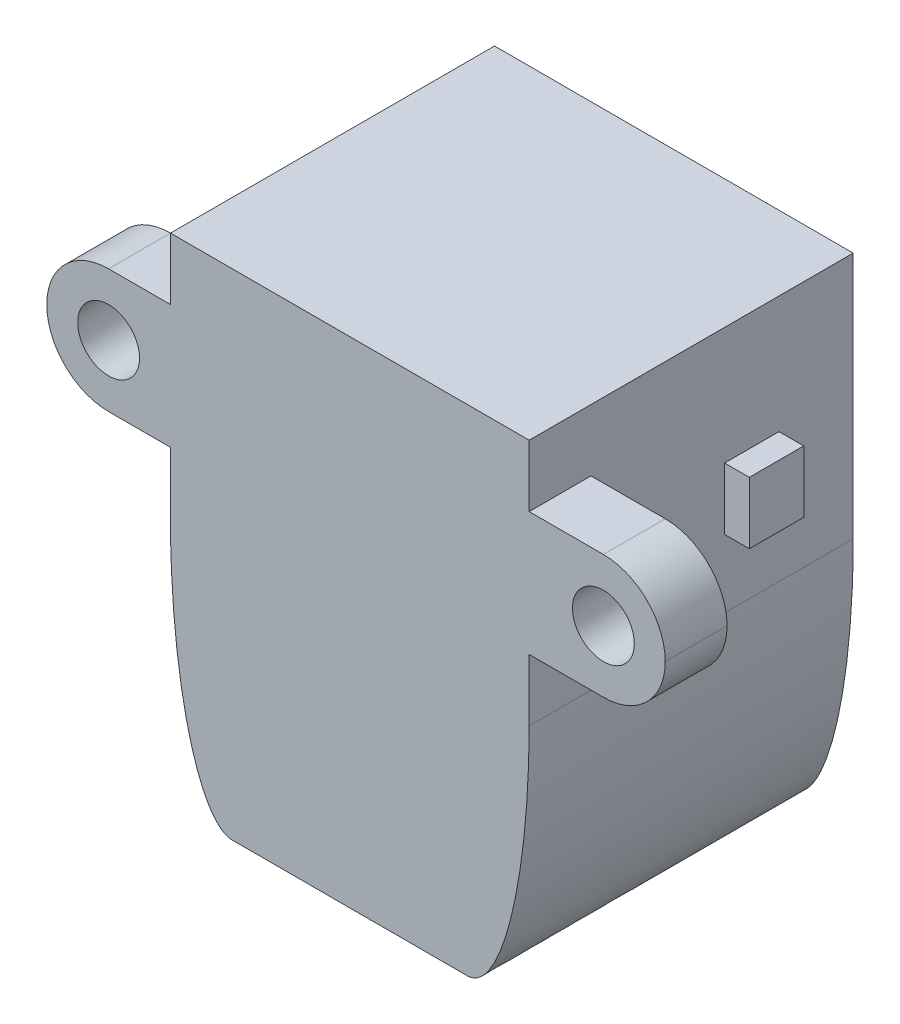
ISO-10303-21;
HEADER;
FILE_DESCRIPTION(('STEP AP214'),'2;1');
FILE_NAME('part.step','',(''),(''),'','','');
FILE_SCHEMA(('AUTOMOTIVE_DESIGN { 1 0 10303 214 1 1 1 1 }'));
ENDSEC;
DATA;
#1=APPLICATION_CONTEXT('core data for automotive mechanical design processes');
#2=APPLICATION_PROTOCOL_DEFINITION('international standard','automotive_design',2000,#1);
#3=PRODUCT_CONTEXT('',#1,'mechanical');
#4=PRODUCT('Part','Part','',(#3));
#5=PRODUCT_RELATED_PRODUCT_CATEGORY('part','',(#4));
#6=PRODUCT_DEFINITION_FORMATION('','',#4);
#7=PRODUCT_DEFINITION_CONTEXT('part definition',#1,'design');
#8=PRODUCT_DEFINITION('design','',#6,#7);
#9=PRODUCT_DEFINITION_SHAPE('','',#8);
#10=(LENGTH_UNIT() NAMED_UNIT(*) SI_UNIT(.MILLI.,.METRE.));
#11=(NAMED_UNIT(*) PLANE_ANGLE_UNIT() SI_UNIT($,.RADIAN.));
#12=(NAMED_UNIT(*) SI_UNIT($,.STERADIAN.) SOLID_ANGLE_UNIT());
#13=UNCERTAINTY_MEASURE_WITH_UNIT(LENGTH_MEASURE(1.E-05),#10,'distance_accuracy_value','');
#14=(GEOMETRIC_REPRESENTATION_CONTEXT(3) GLOBAL_UNCERTAINTY_ASSIGNED_CONTEXT((#13)) GLOBAL_UNIT_ASSIGNED_CONTEXT((#10,
#11,#12)) REPRESENTATION_CONTEXT('',''));
#15=CARTESIAN_POINT('',(0.,0.,0.));
#16=DIRECTION('',(0.,0.,1.));
#17=DIRECTION('',(1.,0.,0.));
#18=AXIS2_PLACEMENT_3D('',#15,#16,#17);
#19=CARTESIAN_POINT('',(0.,0.,26.2));
#20=DIRECTION('',(1.,0.,0.));
#21=DIRECTION('',(0.,1.,0.));
#22=AXIS2_PLACEMENT_3D('',#19,#20,#21);
#23=PLANE('',#22);
#24=DIRECTION('',(0.,1.,0.));
#25=VECTOR('',#24,1.);
#26=CARTESIAN_POINT('',(0.,0.,5.99999999999999));
#27=LINE('',#26,#25);
#28=CARTESIAN_POINT('',(0.,-14.5,6.));
#29=VERTEX_POINT('',#28);
#30=CARTESIAN_POINT('',(0.,-9.5,6.));
#31=VERTEX_POINT('',#30);
#32=EDGE_CURVE('E271',#29,#31,#27,.T.);
#33=ORIENTED_EDGE('',*,*,#32,.T.);
#34=DIRECTION('',(0.,0.,1.));
#35=VECTOR('',#34,1.);
#36=CARTESIAN_POINT('',(0.,-9.5,26.2));
#37=LINE('',#36,#35);
#38=CARTESIAN_POINT('',(0.,-9.5,10.4));
#39=VERTEX_POINT('',#38);
#40=EDGE_CURVE('E275',#31,#39,#37,.T.);
#41=ORIENTED_EDGE('',*,*,#40,.T.);
#42=DIRECTION('',(0.,-1.,0.));
#43=VECTOR('',#42,1.);
#44=CARTESIAN_POINT('',(0.,0.,10.4));
#45=LINE('',#44,#43);
#46=CARTESIAN_POINT('',(0.,-14.5,10.4));
#47=VERTEX_POINT('',#46);
#48=EDGE_CURVE('E253',#39,#47,#45,.T.);
#49=ORIENTED_EDGE('',*,*,#48,.T.);
#50=DIRECTION('',(0.,0.,-1.));
#51=VECTOR('',#50,1.);
#52=CARTESIAN_POINT('',(0.,-14.5,26.2));
#53=LINE('',#52,#51);
#54=EDGE_CURVE('E267',#47,#29,#53,.T.);
#55=ORIENTED_EDGE('',*,*,#54,.T.);
#56=EDGE_LOOP('',(#33,#41,#49,#55));
#57=FACE_BOUND('',#56,.T.);
#58=DIRECTION('',(0.,-1.,0.));
#59=VECTOR('',#58,1.);
#60=CARTESIAN_POINT('',(0.,0.,26.2));
#61=LINE('',#60,#59);
#62=CARTESIAN_POINT('',(0.,-15.,26.2));
#63=VERTEX_POINT('',#62);
#64=CARTESIAN_POINT('',(0.,-20.,26.2));
#65=VERTEX_POINT('',#64);
#66=EDGE_CURVE('E335',#63,#65,#61,.T.);
#67=ORIENTED_EDGE('',*,*,#66,.F.);
#68=DIRECTION('',(0.,0.,-1.));
#69=VECTOR('',#68,1.);
#70=CARTESIAN_POINT('',(0.,-15.,26.2));
#71=LINE('',#70,#69);
#72=CARTESIAN_POINT('',(0.,-15.,21.2));
#73=VERTEX_POINT('',#72);
#74=EDGE_CURVE('E316',#63,#73,#71,.T.);
#75=ORIENTED_EDGE('',*,*,#74,.T.);
#76=DIRECTION('',(0.,1.,0.));
#77=VECTOR('',#76,1.);
#78=CARTESIAN_POINT('',(0.,0.,21.2));
#79=LINE('',#78,#77);
#80=CARTESIAN_POINT('',(0.,-5.,21.2));
#81=VERTEX_POINT('',#80);
#82=EDGE_CURVE('E320',#73,#81,#79,.T.);
#83=ORIENTED_EDGE('',*,*,#82,.T.);
#84=DIRECTION('',(0.,0.,1.));
#85=VECTOR('',#84,1.);
#86=CARTESIAN_POINT('',(0.,-5.,26.2));
#87=LINE('',#86,#85);
#88=CARTESIAN_POINT('',(0.,-5.,26.2));
#89=VERTEX_POINT('',#88);
#90=EDGE_CURVE('E308',#81,#89,#87,.T.);
#91=ORIENTED_EDGE('',*,*,#90,.T.);
#92=CARTESIAN_POINT('',(0.,0.,26.2));
#93=VERTEX_POINT('',#92);
#94=EDGE_CURVE('E331',#93,#89,#61,.T.);
#95=ORIENTED_EDGE('',*,*,#94,.F.);
#96=DIRECTION('',(0.,0.,-1.));
#97=VECTOR('',#96,1.);
#98=CARTESIAN_POINT('',(0.,0.,26.2));
#99=LINE('',#98,#97);
#100=CARTESIAN_POINT('',(0.,0.,0.));
#101=VERTEX_POINT('',#100);
#102=EDGE_CURVE('E605',#93,#101,#99,.T.);
#103=ORIENTED_EDGE('',*,*,#102,.T.);
#104=DIRECTION('',(0.,-1.,0.));
#105=VECTOR('',#104,1.);
#106=CARTESIAN_POINT('',(0.,0.,0.));
#107=LINE('',#106,#105);
#108=CARTESIAN_POINT('',(0.,-20.,0.));
#109=VERTEX_POINT('',#108);
#110=EDGE_CURVE('E324',#101,#109,#107,.T.);
#111=ORIENTED_EDGE('',*,*,#110,.T.);
#112=CARTESIAN_POINT('',(0.,-20.,27.51));
#113=CARTESIAN_POINT('',(0.,-20.,17.9033333333333));
#114=CARTESIAN_POINT('',(0.,-20.,8.29666666666666));
#115=CARTESIAN_POINT('',(0.,-20.,-1.31));
#116=(BOUNDED_CURVE() B_SPLINE_CURVE(3,(#112,#113,#114,#115),.UNSPECIFIED.,.F.,
.F.) B_SPLINE_CURVE_WITH_KNOTS((4,4),(-0.00131,0.02751),
.UNSPECIFIED.) CURVE() GEOMETRIC_REPRESENTATION_ITEM() RATIONAL_B_SPLINE_CURVE((1.,1.,1.,1.)) REPRESENTATION_ITEM(''));
#117=EDGE_CURVE('E347',#109,#65,#116,.F.);
#118=ORIENTED_EDGE('',*,*,#117,.T.);
#119=EDGE_LOOP('',(#67,#75,#83,#91,#95,#103,#111,#118));
#120=FACE_BOUND('',#119,.T.);
#121=ADVANCED_FACE('F45',(#57,#120),#23,.F.);
#122=CARTESIAN_POINT('',(0.,-40.,26.2));
#123=DIRECTION('',(0.,1.,0.));
#124=DIRECTION('',(0.,0.,1.));
#125=AXIS2_PLACEMENT_3D('',#122,#123,#124);
#126=PLANE('',#125);
#127=DIRECTION('',(1.,0.,0.));
#128=VECTOR('',#127,1.);
#129=CARTESIAN_POINT('',(0.,-40.,0.));
#130=LINE('',#129,#128);
#131=CARTESIAN_POINT('',(5.,-40.,0.));
#132=VERTEX_POINT('',#131);
#133=CARTESIAN_POINT('',(24.,-40.,0.));
#134=VERTEX_POINT('',#133);
#135=EDGE_CURVE('E621',#132,#134,#130,.T.);
#136=ORIENTED_EDGE('',*,*,#135,.T.);
#137=CARTESIAN_POINT('',(24.,-40.,27.51));
#138=CARTESIAN_POINT('',(24.,-40.,17.9033333333333));
#139=CARTESIAN_POINT('',(24.,-40.,8.29666666666666));
#140=CARTESIAN_POINT('',(24.,-40.,-1.31));
#141=(BOUNDED_CURVE() B_SPLINE_CURVE(3,(#137,#138,#139,#140),.UNSPECIFIED.,.F.,
.F.) B_SPLINE_CURVE_WITH_KNOTS((4,4),(-0.00131,0.02751),
.UNSPECIFIED.) CURVE() GEOMETRIC_REPRESENTATION_ITEM() RATIONAL_B_SPLINE_CURVE((1.,1.,1.,1.)) REPRESENTATION_ITEM(''));
#142=CARTESIAN_POINT('',(24.,-40.,26.2));
#143=VERTEX_POINT('',#142);
#144=EDGE_CURVE('E499',#134,#143,#141,.F.);
#145=ORIENTED_EDGE('',*,*,#144,.T.);
#146=DIRECTION('',(1.,0.,0.));
#147=VECTOR('',#146,1.);
#148=CARTESIAN_POINT('',(0.,-40.,26.2));
#149=LINE('',#148,#147);
#150=CARTESIAN_POINT('',(5.,-40.,26.2));
#151=VERTEX_POINT('',#150);
#152=EDGE_CURVE('E648',#151,#143,#149,.T.);
#153=ORIENTED_EDGE('',*,*,#152,.F.);
#154=CARTESIAN_POINT('',(5.,-40.,-1.31));
#155=CARTESIAN_POINT('',(5.,-40.,8.29666666666666));
#156=CARTESIAN_POINT('',(5.,-40.,17.9033333333333));
#157=CARTESIAN_POINT('',(5.,-40.,27.51));
#158=(BOUNDED_CURVE() B_SPLINE_CURVE(3,(#154,#155,#156,#157),.UNSPECIFIED.,.F.,
.F.) B_SPLINE_CURVE_WITH_KNOTS((4,4),(-0.00131,0.02751),
.UNSPECIFIED.) CURVE() GEOMETRIC_REPRESENTATION_ITEM() RATIONAL_B_SPLINE_CURVE((1.,1.,1.,1.)) REPRESENTATION_ITEM(''));
#159=EDGE_CURVE('E587',#151,#132,#158,.F.);
#160=ORIENTED_EDGE('',*,*,#159,.T.);
#161=EDGE_LOOP('',(#136,#145,#153,#160));
#162=FACE_BOUND('',#161,.T.);
#163=ADVANCED_FACE('F433',(#162),#126,.F.);
#164=CARTESIAN_POINT('',(29.,0.,26.2));
#165=DIRECTION('',(-1.,0.,0.));
#166=DIRECTION('',(0.,-1.,0.));
#167=AXIS2_PLACEMENT_3D('',#164,#165,#166);
#168=PLANE('',#167);
#169=DIRECTION('',(0.,1.,0.));
#170=VECTOR('',#169,1.);
#171=CARTESIAN_POINT('',(29.,0.,10.4));
#172=LINE('',#171,#170);
#173=CARTESIAN_POINT('',(29.,-14.5,10.4));
#174=VERTEX_POINT('',#173);
#175=CARTESIAN_POINT('',(29.,-9.5,10.4));
#176=VERTEX_POINT('',#175);
#177=EDGE_CURVE('E385',#174,#176,#172,.T.);
#178=ORIENTED_EDGE('',*,*,#177,.T.);
#179=DIRECTION('',(0.,0.,-1.));
#180=VECTOR('',#179,1.);
#181=CARTESIAN_POINT('',(29.,-9.5,26.2));
#182=LINE('',#181,#180);
#183=CARTESIAN_POINT('',(29.,-9.5,6.));
#184=VERTEX_POINT('',#183);
#185=EDGE_CURVE('E12',#176,#184,#182,.T.);
#186=ORIENTED_EDGE('',*,*,#185,.T.);
#187=DIRECTION('',(0.,-1.,0.));
#188=VECTOR('',#187,1.);
#189=CARTESIAN_POINT('',(29.,0.,5.99999999999999));
#190=LINE('',#189,#188);
#191=CARTESIAN_POINT('',(29.,-14.5,6.));
#192=VERTEX_POINT('',#191);
#193=EDGE_CURVE('E54',#184,#192,#190,.T.);
#194=ORIENTED_EDGE('',*,*,#193,.T.);
#195=DIRECTION('',(0.,0.,1.));
#196=VECTOR('',#195,1.);
#197=CARTESIAN_POINT('',(29.,-14.5,26.2));
#198=LINE('',#197,#196);
#199=EDGE_CURVE('E403',#192,#174,#198,.T.);
#200=ORIENTED_EDGE('',*,*,#199,.T.);
#201=EDGE_LOOP('',(#178,#186,#194,#200));
#202=FACE_BOUND('',#201,.T.);
#203=DIRECTION('',(0.,-1.,0.));
#204=VECTOR('',#203,1.);
#205=CARTESIAN_POINT('',(29.,0.,21.2));
#206=LINE('',#205,#204);
#207=CARTESIAN_POINT('',(29.,-5.,21.2));
#208=VERTEX_POINT('',#207);
#209=CARTESIAN_POINT('',(29.,-15.,21.2));
#210=VERTEX_POINT('',#209);
#211=EDGE_CURVE('E342',#208,#210,#206,.T.);
#212=ORIENTED_EDGE('',*,*,#211,.T.);
#213=DIRECTION('',(0.,0.,1.));
#214=VECTOR('',#213,1.);
#215=CARTESIAN_POINT('',(29.,-15.,26.2));
#216=LINE('',#215,#214);
#217=CARTESIAN_POINT('',(29.,-15.,26.2));
#218=VERTEX_POINT('',#217);
#219=EDGE_CURVE('E312',#210,#218,#216,.T.);
#220=ORIENTED_EDGE('',*,*,#219,.T.);
#221=DIRECTION('',(0.,1.,0.));
#222=VECTOR('',#221,1.);
#223=CARTESIAN_POINT('',(29.,0.,26.2));
#224=LINE('',#223,#222);
#225=CARTESIAN_POINT('',(29.,-20.,26.2));
#226=VERTEX_POINT('',#225);
#227=EDGE_CURVE('E622',#226,#218,#224,.T.);
#228=ORIENTED_EDGE('',*,*,#227,.F.);
#229=CARTESIAN_POINT('',(29.,-20.,-1.31));
#230=CARTESIAN_POINT('',(29.,-20.,8.29666666666666));
#231=CARTESIAN_POINT('',(29.,-20.,17.9033333333333));
#232=CARTESIAN_POINT('',(29.,-20.,27.51));
#233=(BOUNDED_CURVE() B_SPLINE_CURVE(3,(#229,#230,#231,#232),.UNSPECIFIED.,.F.,
.F.) B_SPLINE_CURVE_WITH_KNOTS((4,4),(-0.00131,0.02751),
.UNSPECIFIED.) CURVE() GEOMETRIC_REPRESENTATION_ITEM() RATIONAL_B_SPLINE_CURVE((1.,1.,1.,1.)) REPRESENTATION_ITEM(''));
#234=CARTESIAN_POINT('',(29.,-20.,0.));
#235=VERTEX_POINT('',#234);
#236=EDGE_CURVE('E479',#226,#235,#233,.F.);
#237=ORIENTED_EDGE('',*,*,#236,.T.);
#238=DIRECTION('',(0.,1.,0.));
#239=VECTOR('',#238,1.);
#240=CARTESIAN_POINT('',(29.,0.,0.));
#241=LINE('',#240,#239);
#242=CARTESIAN_POINT('',(29.,0.,0.));
#243=VERTEX_POINT('',#242);
#244=EDGE_CURVE('E617',#235,#243,#241,.T.);
#245=ORIENTED_EDGE('',*,*,#244,.T.);
#246=DIRECTION('',(0.,0.,-1.));
#247=VECTOR('',#246,1.);
#248=CARTESIAN_POINT('',(29.,0.,26.2));
#249=LINE('',#248,#247);
#250=CARTESIAN_POINT('',(29.,0.,26.2));
#251=VERTEX_POINT('',#250);
#252=EDGE_CURVE('E601',#251,#243,#249,.T.);
#253=ORIENTED_EDGE('',*,*,#252,.F.);
#254=CARTESIAN_POINT('',(29.,-5.,26.2));
#255=VERTEX_POINT('',#254);
#256=EDGE_CURVE('E340',#255,#251,#224,.T.);
#257=ORIENTED_EDGE('',*,*,#256,.F.);
#258=DIRECTION('',(0.,0.,-1.));
#259=VECTOR('',#258,1.);
#260=CARTESIAN_POINT('',(29.,-5.,26.2));
#261=LINE('',#260,#259);
#262=EDGE_CURVE('E291',#255,#208,#261,.T.);
#263=ORIENTED_EDGE('',*,*,#262,.T.);
#264=EDGE_LOOP('',(#212,#220,#228,#237,#245,#253,#257,#263));
#265=FACE_BOUND('',#264,.T.);
#266=ADVANCED_FACE('F409',(#202,#265),#168,.F.);
#267=CARTESIAN_POINT('',(0.,0.,26.2));
#268=DIRECTION('',(0.,-1.,0.));
#269=DIRECTION('',(0.,0.,-1.));
#270=AXIS2_PLACEMENT_3D('',#267,#268,#269);
#271=PLANE('',#270);
#272=DIRECTION('',(-1.,0.,0.));
#273=VECTOR('',#272,1.);
#274=CARTESIAN_POINT('',(0.,0.,0.));
#275=LINE('',#274,#273);
#276=EDGE_CURVE('E339',#243,#101,#275,.T.);
#277=ORIENTED_EDGE('',*,*,#276,.T.);
#278=ORIENTED_EDGE('',*,*,#102,.F.);
#279=DIRECTION('',(-1.,0.,0.));
#280=VECTOR('',#279,1.);
#281=CARTESIAN_POINT('',(0.,0.,26.2));
#282=LINE('',#281,#280);
#283=EDGE_CURVE('E613',#251,#93,#282,.T.);
#284=ORIENTED_EDGE('',*,*,#283,.F.);
#285=ORIENTED_EDGE('',*,*,#252,.T.);
#286=EDGE_LOOP('',(#277,#278,#284,#285));
#287=FACE_BOUND('',#286,.T.);
#288=ADVANCED_FACE('F629',(#287),#271,.F.);
#289=CARTESIAN_POINT('',(0.,0.,26.2));
#290=DIRECTION('',(0.,0.,1.));
#291=DIRECTION('',(1.,0.,0.));
#292=AXIS2_PLACEMENT_3D('',#289,#290,#291);
#293=PLANE('',#292);
#294=CARTESIAN_POINT('',(-5.,-10.,26.2));
#295=DIRECTION('',(0.,0.,1.));
#296=DIRECTION('',(1.,0.,0.));
#297=AXIS2_PLACEMENT_3D('',#294,#295,#296);
#298=CIRCLE('',#297,2.5);
#299=CARTESIAN_POINT('',(-2.5,-10.,26.2));
#300=VERTEX_POINT('',#299);
#301=EDGE_CURVE('E280',#300,#300,#298,.T.);
#302=ORIENTED_EDGE('',*,*,#301,.F.);
#303=EDGE_LOOP('',(#302));
#304=FACE_BOUND('',#303,.T.);
#305=CARTESIAN_POINT('',(35.,-9.99999999999999,26.2));
#306=DIRECTION('',(0.,0.,1.));
#307=DIRECTION('',(1.,0.,0.));
#308=AXIS2_PLACEMENT_3D('',#305,#306,#307);
#309=CIRCLE('',#308,2.5);
#310=CARTESIAN_POINT('',(37.5,-9.99999999999999,26.2));
#311=VERTEX_POINT('',#310);
#312=EDGE_CURVE('E279',#311,#311,#309,.T.);
#313=ORIENTED_EDGE('',*,*,#312,.F.);
#314=EDGE_LOOP('',(#313));
#315=FACE_BOUND('',#314,.T.);
#316=DIRECTION('',(-1.,0.,0.));
#317=VECTOR('',#316,1.);
#318=CARTESIAN_POINT('',(40.,-15.,26.2));
#319=LINE('',#318,#317);
#320=CARTESIAN_POINT('',(35.,-15.,26.2));
#321=VERTEX_POINT('',#320);
#322=EDGE_CURVE('E288',#321,#218,#319,.T.);
#323=ORIENTED_EDGE('',*,*,#322,.F.);
#324=CARTESIAN_POINT('',(35.,-9.99999999999999,26.2));
#325=DIRECTION('',(0.,0.,1.));
#326=DIRECTION('',(1.,0.,0.));
#327=AXIS2_PLACEMENT_3D('',#324,#325,#326);
#328=CIRCLE('',#327,5.);
#329=CARTESIAN_POINT('',(40.,-9.99999999999999,26.2));
#330=VERTEX_POINT('',#329);
#331=EDGE_CURVE('E360',#321,#330,#328,.T.);
#332=ORIENTED_EDGE('',*,*,#331,.T.);
#333=CARTESIAN_POINT('',(35.,-9.99999999999999,26.2));
#334=DIRECTION('',(0.,0.,1.));
#335=DIRECTION('',(1.,0.,0.));
#336=AXIS2_PLACEMENT_3D('',#333,#334,#335);
#337=CIRCLE('',#336,5.);
#338=CARTESIAN_POINT('',(35.,-5.,26.2));
#339=VERTEX_POINT('',#338);
#340=EDGE_CURVE('E357',#330,#339,#337,.T.);
#341=ORIENTED_EDGE('',*,*,#340,.T.);
#342=DIRECTION('',(-1.,0.,0.));
#343=VECTOR('',#342,1.);
#344=CARTESIAN_POINT('',(40.,-4.99999999999999,26.2));
#345=LINE('',#344,#343);
#346=EDGE_CURVE('E301',#339,#255,#345,.T.);
#347=ORIENTED_EDGE('',*,*,#346,.T.);
#348=ORIENTED_EDGE('',*,*,#256,.T.);
#349=ORIENTED_EDGE('',*,*,#283,.T.);
#350=ORIENTED_EDGE('',*,*,#94,.T.);
#351=CARTESIAN_POINT('',(-5.,-5.,26.2));
#352=VERTEX_POINT('',#351);
#353=EDGE_CURVE('E304',#89,#352,#345,.T.);
#354=ORIENTED_EDGE('',*,*,#353,.T.);
#355=CARTESIAN_POINT('',(-5.,-10.,26.2));
#356=DIRECTION('',(0.,0.,1.));
#357=DIRECTION('',(1.,0.,0.));
#358=AXIS2_PLACEMENT_3D('',#355,#356,#357);
#359=CIRCLE('',#358,5.);
#360=CARTESIAN_POINT('',(-10.,-10.,26.2));
#361=VERTEX_POINT('',#360);
#362=EDGE_CURVE('E351',#352,#361,#359,.T.);
#363=ORIENTED_EDGE('',*,*,#362,.T.);
#364=CARTESIAN_POINT('',(-5.,-10.,26.2));
#365=DIRECTION('',(0.,0.,1.));
#366=DIRECTION('',(1.,0.,0.));
#367=AXIS2_PLACEMENT_3D('',#364,#365,#366);
#368=CIRCLE('',#367,5.);
#369=CARTESIAN_POINT('',(-5.,-15.,26.2));
#370=VERTEX_POINT('',#369);
#371=EDGE_CURVE('E354',#361,#370,#368,.T.);
#372=ORIENTED_EDGE('',*,*,#371,.T.);
#373=EDGE_CURVE('E292',#63,#370,#319,.T.);
#374=ORIENTED_EDGE('',*,*,#373,.F.);
#375=ORIENTED_EDGE('',*,*,#66,.T.);
#376=CARTESIAN_POINT('',(5.,-40.,26.2));
#377=CARTESIAN_POINT('',(0.,-40.,26.2));
#378=CARTESIAN_POINT('',(0.,-20.,26.2));
#379=(BOUNDED_CURVE() B_SPLINE_CURVE(2,(#376,#377,#378),.UNSPECIFIED.,.F.,
.F.) B_SPLINE_CURVE_WITH_KNOTS((3,3),(0.,1.),
.UNSPECIFIED.) CURVE() GEOMETRIC_REPRESENTATION_ITEM() RATIONAL_B_SPLINE_CURVE((1.,
0.707106781186548,1.)) REPRESENTATION_ITEM(''));
#380=EDGE_CURVE('E574',#65,#151,#379,.F.);
#381=ORIENTED_EDGE('',*,*,#380,.T.);
#382=ORIENTED_EDGE('',*,*,#152,.T.);
#383=CARTESIAN_POINT('',(29.,-20.,26.2));
#384=CARTESIAN_POINT('',(29.,-40.,26.2));
#385=CARTESIAN_POINT('',(24.,-40.,26.2));
#386=(BOUNDED_CURVE() B_SPLINE_CURVE(2,(#383,#384,#385),.UNSPECIFIED.,.F.,
.F.) B_SPLINE_CURVE_WITH_KNOTS((3,3),(0.,1.),
.UNSPECIFIED.) CURVE() GEOMETRIC_REPRESENTATION_ITEM() RATIONAL_B_SPLINE_CURVE((1.,
0.707106781186547,1.)) REPRESENTATION_ITEM(''));
#387=EDGE_CURVE('E489',#143,#226,#386,.F.);
#388=ORIENTED_EDGE('',*,*,#387,.T.);
#389=ORIENTED_EDGE('',*,*,#227,.T.);
#390=EDGE_LOOP('',(#323,#332,#341,#347,#348,#349,#350,#354,#363,#372,#374,#375,#381,#382,#388,#389));
#391=FACE_BOUND('',#390,.T.);
#392=ADVANCED_FACE('F682',(#304,#315,#391),#293,.T.);
#393=CARTESIAN_POINT('',(0.,0.,0.));
#394=DIRECTION('',(0.,0.,1.));
#395=DIRECTION('',(1.,0.,0.));
#396=AXIS2_PLACEMENT_3D('',#393,#394,#395);
#397=PLANE('',#396);
#398=ORIENTED_EDGE('',*,*,#244,.F.);
#399=CARTESIAN_POINT('',(24.,-40.,0.));
#400=CARTESIAN_POINT('',(29.,-40.,0.));
#401=CARTESIAN_POINT('',(29.,-20.,0.));
#402=(BOUNDED_CURVE() B_SPLINE_CURVE(2,(#399,#400,#401),.UNSPECIFIED.,.F.,
.F.) B_SPLINE_CURVE_WITH_KNOTS((3,3),(0.,1.),
.UNSPECIFIED.) CURVE() GEOMETRIC_REPRESENTATION_ITEM() RATIONAL_B_SPLINE_CURVE((1.,
0.707106781186547,1.)) REPRESENTATION_ITEM(''));
#403=EDGE_CURVE('E467',#235,#134,#402,.F.);
#404=ORIENTED_EDGE('',*,*,#403,.T.);
#405=ORIENTED_EDGE('',*,*,#135,.F.);
#406=CARTESIAN_POINT('',(0.,-20.,0.));
#407=CARTESIAN_POINT('',(0.,-40.,0.));
#408=CARTESIAN_POINT('',(5.,-40.,0.));
#409=(BOUNDED_CURVE() B_SPLINE_CURVE(2,(#406,#407,#408),.UNSPECIFIED.,.F.,
.F.) B_SPLINE_CURVE_WITH_KNOTS((3,3),(0.,1.),
.UNSPECIFIED.) CURVE() GEOMETRIC_REPRESENTATION_ITEM() RATIONAL_B_SPLINE_CURVE((1.,
0.707106781186548,1.)) REPRESENTATION_ITEM(''));
#410=EDGE_CURVE('E512',#132,#109,#409,.F.);
#411=ORIENTED_EDGE('',*,*,#410,.T.);
#412=ORIENTED_EDGE('',*,*,#110,.F.);
#413=ORIENTED_EDGE('',*,*,#276,.F.);
#414=EDGE_LOOP('',(#398,#404,#405,#411,#412,#413));
#415=FACE_BOUND('',#414,.T.);
#416=ADVANCED_FACE('F632',(#415),#397,.F.);
#417=CARTESIAN_POINT('',(29.,-20.,27.51));
#418=CARTESIAN_POINT('',(29.,-20.,17.9033333333333));
#419=CARTESIAN_POINT('',(29.,-20.,8.29666666666666));
#420=CARTESIAN_POINT('',(29.,-20.,-1.31));
#421=CARTESIAN_POINT('',(29.,-40.,27.51));
#422=CARTESIAN_POINT('',(29.,-40.,17.9033333333333));
#423=CARTESIAN_POINT('',(29.,-40.,8.29666666666666));
#424=CARTESIAN_POINT('',(29.,-40.,-1.31));
#425=CARTESIAN_POINT('',(24.,-40.,27.51));
#426=CARTESIAN_POINT('',(24.,-40.,17.9033333333333));
#427=CARTESIAN_POINT('',(24.,-40.,8.29666666666666));
#428=CARTESIAN_POINT('',(24.,-40.,-1.31));
#429=(BOUNDED_SURFACE() B_SPLINE_SURFACE(2,3,((#417,#418,#419,#420),(#421,#422,#423,#424),(#425,
#426,#427,#428)),.UNSPECIFIED.,.F.,.F.,.F.) B_SPLINE_SURFACE_WITH_KNOTS((3,3),(4,4),(0.,1.),
(-0.00131,0.02751),
.UNSPECIFIED.) GEOMETRIC_REPRESENTATION_ITEM() RATIONAL_B_SPLINE_SURFACE(((1.,1.,1.,1.),
(0.707106781186547,0.707106781186547,0.707106781186547,0.707106781186547),(1.,1.,1.,1.))) REPRESENTATION_ITEM('') SURFACE());
#430=ORIENTED_EDGE('',*,*,#387,.F.);
#431=ORIENTED_EDGE('',*,*,#144,.F.);
#432=ORIENTED_EDGE('',*,*,#403,.F.);
#433=ORIENTED_EDGE('',*,*,#236,.F.);
#434=EDGE_LOOP('',(#430,#431,#432,#433));
#435=FACE_BOUND('',#434,.T.);
#436=ADVANCED_FACE('F447',(#435),#429,.T.);
#437=CARTESIAN_POINT('',(5.,-40.,27.51));
#438=CARTESIAN_POINT('',(5.,-40.,17.9033333333333));
#439=CARTESIAN_POINT('',(5.,-40.,8.29666666666666));
#440=CARTESIAN_POINT('',(5.,-40.,-1.31));
#441=CARTESIAN_POINT('',(0.,-40.,27.51));
#442=CARTESIAN_POINT('',(0.,-40.,17.9033333333333));
#443=CARTESIAN_POINT('',(0.,-40.,8.29666666666666));
#444=CARTESIAN_POINT('',(0.,-40.,-1.31));
#445=CARTESIAN_POINT('',(0.,-20.,27.51));
#446=CARTESIAN_POINT('',(0.,-20.,17.9033333333333));
#447=CARTESIAN_POINT('',(0.,-20.,8.29666666666666));
#448=CARTESIAN_POINT('',(0.,-20.,-1.31));
#449=(BOUNDED_SURFACE() B_SPLINE_SURFACE(2,3,((#437,#438,#439,#440),(#441,#442,#443,#444),(#445,
#446,#447,#448)),.UNSPECIFIED.,.F.,.F.,.F.) B_SPLINE_SURFACE_WITH_KNOTS((3,3),(4,4),(0.,1.),
(-0.00131,0.02751),
.UNSPECIFIED.) GEOMETRIC_REPRESENTATION_ITEM() RATIONAL_B_SPLINE_SURFACE(((1.,1.,1.,1.),
(0.707106781186548,0.707106781186548,0.707106781186548,0.707106781186548),(1.,1.,1.,1.))) REPRESENTATION_ITEM('') SURFACE());
#450=ORIENTED_EDGE('',*,*,#380,.F.);
#451=ORIENTED_EDGE('',*,*,#117,.F.);
#452=ORIENTED_EDGE('',*,*,#410,.F.);
#453=ORIENTED_EDGE('',*,*,#159,.F.);
#454=EDGE_LOOP('',(#450,#451,#452,#453));
#455=FACE_BOUND('',#454,.T.);
#456=ADVANCED_FACE('F519',(#455),#449,.T.);
#457=CARTESIAN_POINT('',(40.,-4.99999999999999,26.2));
#458=DIRECTION('',(0.,1.,0.));
#459=DIRECTION('',(0.,0.,1.));
#460=AXIS2_PLACEMENT_3D('',#457,#458,#459);
#461=PLANE('',#460);
#462=ORIENTED_EDGE('',*,*,#346,.F.);
#463=DIRECTION('',(0.,0.,-1.));
#464=VECTOR('',#463,1.);
#465=CARTESIAN_POINT('',(35.,-5.,26.2));
#466=LINE('',#465,#464);
#467=CARTESIAN_POINT('',(35.,-5.,21.2));
#468=VERTEX_POINT('',#467);
#469=EDGE_CURVE('E369',#339,#468,#466,.T.);
#470=ORIENTED_EDGE('',*,*,#469,.T.);
#471=DIRECTION('',(-1.,0.,0.));
#472=VECTOR('',#471,1.);
#473=CARTESIAN_POINT('',(40.,-5.,21.2));
#474=LINE('',#473,#472);
#475=EDGE_CURVE('E297',#468,#208,#474,.T.);
#476=ORIENTED_EDGE('',*,*,#475,.T.);
#477=ORIENTED_EDGE('',*,*,#262,.F.);
#478=EDGE_LOOP('',(#462,#470,#476,#477));
#479=FACE_BOUND('',#478,.T.);
#480=ADVANCED_FACE('F532',(#479),#461,.T.);
#481=CARTESIAN_POINT('',(40.,-5.,21.2));
#482=DIRECTION('',(0.,0.,-1.));
#483=DIRECTION('',(-1.,0.,0.));
#484=AXIS2_PLACEMENT_3D('',#481,#482,#483);
#485=PLANE('',#484);
#486=CARTESIAN_POINT('',(35.,-9.99999999999999,21.2));
#487=DIRECTION('',(0.,0.,-1.));
#488=DIRECTION('',(-1.,0.,0.));
#489=AXIS2_PLACEMENT_3D('',#486,#487,#488);
#490=CIRCLE('',#489,2.5);
#491=CARTESIAN_POINT('',(32.5,-9.99999999999999,21.2));
#492=VERTEX_POINT('',#491);
#493=EDGE_CURVE('E394',#492,#492,#490,.T.);
#494=ORIENTED_EDGE('',*,*,#493,.F.);
#495=EDGE_LOOP('',(#494));
#496=FACE_BOUND('',#495,.T.);
#497=CARTESIAN_POINT('',(35.,-9.99999999999999,21.2));
#498=DIRECTION('',(0.,0.,-1.));
#499=DIRECTION('',(-1.,0.,0.));
#500=AXIS2_PLACEMENT_3D('',#497,#498,#499);
#501=CIRCLE('',#500,5.);
#502=CARTESIAN_POINT('',(40.,-9.99999999999999,21.2));
#503=VERTEX_POINT('',#502);
#504=EDGE_CURVE('E363',#468,#503,#501,.T.);
#505=ORIENTED_EDGE('',*,*,#504,.T.);
#506=CARTESIAN_POINT('',(35.,-10.,21.2));
#507=DIRECTION('',(0.,0.,-1.));
#508=DIRECTION('',(-1.,0.,0.));
#509=AXIS2_PLACEMENT_3D('',#506,#507,#508);
#510=CIRCLE('',#509,5.);
#511=CARTESIAN_POINT('',(35.,-15.,21.2));
#512=VERTEX_POINT('',#511);
#513=EDGE_CURVE('E366',#503,#512,#510,.T.);
#514=ORIENTED_EDGE('',*,*,#513,.T.);
#515=DIRECTION('',(-1.,0.,0.));
#516=VECTOR('',#515,1.);
#517=CARTESIAN_POINT('',(40.,-15.,21.2));
#518=LINE('',#517,#516);
#519=EDGE_CURVE('E293',#512,#210,#518,.T.);
#520=ORIENTED_EDGE('',*,*,#519,.T.);
#521=ORIENTED_EDGE('',*,*,#211,.F.);
#522=ORIENTED_EDGE('',*,*,#475,.F.);
#523=EDGE_LOOP('',(#505,#514,#520,#521,#522));
#524=FACE_BOUND('',#523,.T.);
#525=ADVANCED_FACE('F732',(#496,#524),#485,.T.);
#526=CARTESIAN_POINT('',(40.,-15.,26.2));
#527=DIRECTION('',(0.,-1.,0.));
#528=DIRECTION('',(0.,0.,-1.));
#529=AXIS2_PLACEMENT_3D('',#526,#527,#528);
#530=PLANE('',#529);
#531=ORIENTED_EDGE('',*,*,#519,.F.);
#532=DIRECTION('',(0.,0.,1.));
#533=VECTOR('',#532,1.);
#534=CARTESIAN_POINT('',(35.,-15.,26.2));
#535=LINE('',#534,#533);
#536=EDGE_CURVE('E346',#512,#321,#535,.T.);
#537=ORIENTED_EDGE('',*,*,#536,.T.);
#538=ORIENTED_EDGE('',*,*,#322,.T.);
#539=ORIENTED_EDGE('',*,*,#219,.F.);
#540=EDGE_LOOP('',(#531,#537,#538,#539));
#541=FACE_BOUND('',#540,.T.);
#542=ADVANCED_FACE('F740',(#541),#530,.T.);
#543=CARTESIAN_POINT('',(-5.,-10.,21.2));
#544=DIRECTION('',(0.,0.,-1.));
#545=DIRECTION('',(-1.,0.,0.));
#546=AXIS2_PLACEMENT_3D('',#543,#544,#545);
#547=CIRCLE('',#546,2.5);
#548=CARTESIAN_POINT('',(-7.5,-10.,21.2));
#549=VERTEX_POINT('',#548);
#550=EDGE_CURVE('E284',#549,#549,#547,.T.);
#551=ORIENTED_EDGE('',*,*,#550,.F.);
#552=EDGE_LOOP('',(#551));
#553=FACE_BOUND('',#552,.T.);
#554=CARTESIAN_POINT('',(-5.,-15.,21.2));
#555=VERTEX_POINT('',#554);
#556=EDGE_CURVE('E296',#73,#555,#518,.T.);
#557=ORIENTED_EDGE('',*,*,#556,.T.);
#558=CARTESIAN_POINT('',(-5.,-10.,21.2));
#559=DIRECTION('',(0.,0.,-1.));
#560=DIRECTION('',(-1.,0.,0.));
#561=AXIS2_PLACEMENT_3D('',#558,#559,#560);
#562=CIRCLE('',#561,5.);
#563=CARTESIAN_POINT('',(-10.,-10.,21.2));
#564=VERTEX_POINT('',#563);
#565=EDGE_CURVE('E379',#555,#564,#562,.T.);
#566=ORIENTED_EDGE('',*,*,#565,.T.);
#567=CARTESIAN_POINT('',(-5.,-10.,21.2));
#568=DIRECTION('',(0.,0.,-1.));
#569=DIRECTION('',(-1.,0.,0.));
#570=AXIS2_PLACEMENT_3D('',#567,#568,#569);
#571=CIRCLE('',#570,5.);
#572=CARTESIAN_POINT('',(-5.,-5.,21.2));
#573=VERTEX_POINT('',#572);
#574=EDGE_CURVE('E376',#564,#573,#571,.T.);
#575=ORIENTED_EDGE('',*,*,#574,.T.);
#576=EDGE_CURVE('E300',#81,#573,#474,.T.);
#577=ORIENTED_EDGE('',*,*,#576,.F.);
#578=ORIENTED_EDGE('',*,*,#82,.F.);
#579=EDGE_LOOP('',(#557,#566,#575,#577,#578));
#580=FACE_BOUND('',#579,.T.);
#581=ADVANCED_FACE('F743',(#553,#580),#485,.T.);
#582=ORIENTED_EDGE('',*,*,#373,.T.);
#583=DIRECTION('',(0.,0.,1.));
#584=VECTOR('',#583,1.);
#585=CARTESIAN_POINT('',(-5.,-15.,21.2));
#586=LINE('',#585,#584);
#587=EDGE_CURVE('E372',#370,#555,#586,.F.);
#588=ORIENTED_EDGE('',*,*,#587,.T.);
#589=ORIENTED_EDGE('',*,*,#556,.F.);
#590=ORIENTED_EDGE('',*,*,#74,.F.);
#591=EDGE_LOOP('',(#582,#588,#589,#590));
#592=FACE_BOUND('',#591,.T.);
#593=ADVANCED_FACE('F751',(#592),#530,.T.);
#594=ORIENTED_EDGE('',*,*,#576,.T.);
#595=DIRECTION('',(0.,0.,-1.));
#596=VECTOR('',#595,1.);
#597=CARTESIAN_POINT('',(-5.,-5.,26.2));
#598=LINE('',#597,#596);
#599=EDGE_CURVE('E382',#573,#352,#598,.F.);
#600=ORIENTED_EDGE('',*,*,#599,.T.);
#601=ORIENTED_EDGE('',*,*,#353,.F.);
#602=ORIENTED_EDGE('',*,*,#90,.F.);
#603=EDGE_LOOP('',(#594,#600,#601,#602));
#604=FACE_BOUND('',#603,.T.);
#605=ADVANCED_FACE('F734',(#604),#461,.T.);
#606=CARTESIAN_POINT('',(35.,-9.99999999999999,26.2));
#607=DIRECTION('',(0.,0.,-1.));
#608=DIRECTION('',(0.,1.,0.));
#609=AXIS2_PLACEMENT_3D('',#606,#607,#608);
#610=CYLINDRICAL_SURFACE('',#609,5.);
#611=DIRECTION('',(0.,0.,-1.));
#612=VECTOR('',#611,1.);
#613=CARTESIAN_POINT('',(40.,-10.,0.));
#614=LINE('',#613,#612);
#615=EDGE_CURVE('E386',#503,#330,#614,.F.);
#616=ORIENTED_EDGE('',*,*,#615,.F.);
#617=ORIENTED_EDGE('',*,*,#504,.F.);
#618=ORIENTED_EDGE('',*,*,#469,.F.);
#619=ORIENTED_EDGE('',*,*,#340,.F.);
#620=EDGE_LOOP('',(#616,#617,#618,#619));
#621=FACE_BOUND('',#620,.T.);
#622=ADVANCED_FACE('F769',(#621),#610,.T.);
#623=CARTESIAN_POINT('',(35.,-9.99999999999999,26.2));
#624=DIRECTION('',(0.,0.,1.));
#625=DIRECTION('',(0.,-1.,0.));
#626=AXIS2_PLACEMENT_3D('',#623,#624,#625);
#627=CYLINDRICAL_SURFACE('',#626,5.);
#628=ORIENTED_EDGE('',*,*,#513,.F.);
#629=ORIENTED_EDGE('',*,*,#615,.T.);
#630=ORIENTED_EDGE('',*,*,#331,.F.);
#631=ORIENTED_EDGE('',*,*,#536,.F.);
#632=EDGE_LOOP('',(#628,#629,#630,#631));
#633=FACE_BOUND('',#632,.T.);
#634=ADVANCED_FACE('F533',(#633),#627,.T.);
#635=CARTESIAN_POINT('',(-5.,-10.,0.));
#636=DIRECTION('',(0.,0.,1.));
#637=DIRECTION('',(0.,-1.,0.));
#638=AXIS2_PLACEMENT_3D('',#635,#636,#637);
#639=CYLINDRICAL_SURFACE('',#638,5.);
#640=ORIENTED_EDGE('',*,*,#599,.F.);
#641=ORIENTED_EDGE('',*,*,#574,.F.);
#642=DIRECTION('',(0.,0.,-1.));
#643=VECTOR('',#642,1.);
#644=CARTESIAN_POINT('',(-10.,-10.,21.2));
#645=LINE('',#644,#643);
#646=EDGE_CURVE('E390',#361,#564,#645,.T.);
#647=ORIENTED_EDGE('',*,*,#646,.F.);
#648=ORIENTED_EDGE('',*,*,#362,.F.);
#649=EDGE_LOOP('',(#640,#641,#647,#648));
#650=FACE_BOUND('',#649,.T.);
#651=ADVANCED_FACE('F47',(#650),#639,.T.);
#652=CARTESIAN_POINT('',(-5.,-10.,0.));
#653=DIRECTION('',(0.,0.,-1.));
#654=DIRECTION('',(0.,1.,0.));
#655=AXIS2_PLACEMENT_3D('',#652,#653,#654);
#656=CYLINDRICAL_SURFACE('',#655,5.);
#657=ORIENTED_EDGE('',*,*,#565,.F.);
#658=ORIENTED_EDGE('',*,*,#587,.F.);
#659=ORIENTED_EDGE('',*,*,#371,.F.);
#660=ORIENTED_EDGE('',*,*,#646,.T.);
#661=EDGE_LOOP('',(#657,#658,#659,#660));
#662=FACE_BOUND('',#661,.T.);
#663=ADVANCED_FACE('F788',(#662),#656,.T.);
#664=CARTESIAN_POINT('',(-5.,-10.,20.2));
#665=DIRECTION('',(0.,0.,1.));
#666=DIRECTION('',(1.,0.,0.));
#667=AXIS2_PLACEMENT_3D('',#664,#665,#666);
#668=CYLINDRICAL_SURFACE('',#667,2.5);
#669=ORIENTED_EDGE('',*,*,#550,.T.);
#670=EDGE_LOOP('',(#669));
#671=FACE_BOUND('',#670,.T.);
#672=ORIENTED_EDGE('',*,*,#301,.T.);
#673=EDGE_LOOP('',(#672));
#674=FACE_BOUND('',#673,.T.);
#675=ADVANCED_FACE('F794',(#671,#674),#668,.F.);
#676=CARTESIAN_POINT('',(35.,-9.99999999999999,20.2));
#677=DIRECTION('',(0.,0.,1.));
#678=DIRECTION('',(1.,0.,0.));
#679=AXIS2_PLACEMENT_3D('',#676,#677,#678);
#680=CYLINDRICAL_SURFACE('',#679,2.5);
#681=ORIENTED_EDGE('',*,*,#493,.T.);
#682=EDGE_LOOP('',(#681));
#683=FACE_BOUND('',#682,.T.);
#684=ORIENTED_EDGE('',*,*,#312,.T.);
#685=EDGE_LOOP('',(#684));
#686=FACE_BOUND('',#685,.T.);
#687=ADVANCED_FACE('F800',(#683,#686),#680,.F.);
#688=CARTESIAN_POINT('',(31.,0.,0.));
#689=DIRECTION('',(1.,0.,0.));
#690=DIRECTION('',(0.,0.,-1.));
#691=AXIS2_PLACEMENT_3D('',#688,#689,#690);
#692=PLANE('',#691);
#693=DIRECTION('',(0.,0.,1.));
#694=VECTOR('',#693,1.);
#695=CARTESIAN_POINT('',(31.,-9.5,8.2));
#696=LINE('',#695,#694);
#697=CARTESIAN_POINT('',(31.,-9.5,6.));
#698=VERTEX_POINT('',#697);
#699=CARTESIAN_POINT('',(31.,-9.5,10.4));
#700=VERTEX_POINT('',#699);
#701=EDGE_CURVE('E209',#698,#700,#696,.T.);
#702=ORIENTED_EDGE('',*,*,#701,.T.);
#703=DIRECTION('',(0.,-1.,0.));
#704=VECTOR('',#703,1.);
#705=CARTESIAN_POINT('',(31.,-9.5,10.4));
#706=LINE('',#705,#704);
#707=CARTESIAN_POINT('',(31.,-14.5,10.4));
#708=VERTEX_POINT('',#707);
#709=EDGE_CURVE('E216',#700,#708,#706,.T.);
#710=ORIENTED_EDGE('',*,*,#709,.T.);
#711=DIRECTION('',(0.,0.,-1.));
#712=VECTOR('',#711,1.);
#713=CARTESIAN_POINT('',(31.,-14.5,10.4));
#714=LINE('',#713,#712);
#715=CARTESIAN_POINT('',(31.,-14.5,6.));
#716=VERTEX_POINT('',#715);
#717=EDGE_CURVE('E224',#708,#716,#714,.T.);
#718=ORIENTED_EDGE('',*,*,#717,.T.);
#719=DIRECTION('',(0.,1.,0.));
#720=VECTOR('',#719,1.);
#721=CARTESIAN_POINT('',(31.,-12.,6.));
#722=LINE('',#721,#720);
#723=EDGE_CURVE('E229',#716,#698,#722,.T.);
#724=ORIENTED_EDGE('',*,*,#723,.T.);
#725=EDGE_LOOP('',(#702,#710,#718,#724));
#726=FACE_BOUND('',#725,.T.);
#727=ADVANCED_FACE('F227',(#726),#692,.T.);
#728=CARTESIAN_POINT('',(-2.,-12.,10.4));
#729=DIRECTION('',(0.,0.,1.));
#730=DIRECTION('',(1.,0.,0.));
#731=AXIS2_PLACEMENT_3D('',#728,#729,#730);
#732=PLANE('',#731);
#733=ORIENTED_EDGE('',*,*,#177,.F.);
#734=DIRECTION('',(1.,0.,0.));
#735=VECTOR('',#734,1.);
#736=CARTESIAN_POINT('',(-2.,-14.5,10.4));
#737=LINE('',#736,#735);
#738=EDGE_CURVE('E219',#174,#708,#737,.T.);
#739=ORIENTED_EDGE('',*,*,#738,.T.);
#740=ORIENTED_EDGE('',*,*,#709,.F.);
#741=DIRECTION('',(1.,0.,0.));
#742=VECTOR('',#741,1.);
#743=CARTESIAN_POINT('',(-2.,-9.5,10.4));
#744=LINE('',#743,#742);
#745=EDGE_CURVE('E69',#176,#700,#744,.T.);
#746=ORIENTED_EDGE('',*,*,#745,.F.);
#747=EDGE_LOOP('',(#733,#739,#740,#746));
#748=FACE_BOUND('',#747,.T.);
#749=ADVANCED_FACE('F217',(#748),#732,.T.);
#750=CARTESIAN_POINT('',(-2.,-14.5,6.));
#751=DIRECTION('',(0.,-1.,0.));
#752=DIRECTION('',(0.,0.,-1.));
#753=AXIS2_PLACEMENT_3D('',#750,#751,#752);
#754=PLANE('',#753);
#755=ORIENTED_EDGE('',*,*,#199,.F.);
#756=DIRECTION('',(1.,0.,0.));
#757=VECTOR('',#756,1.);
#758=CARTESIAN_POINT('',(-2.,-14.5,6.));
#759=LINE('',#758,#757);
#760=EDGE_CURVE('E259',#192,#716,#759,.T.);
#761=ORIENTED_EDGE('',*,*,#760,.T.);
#762=ORIENTED_EDGE('',*,*,#717,.F.);
#763=ORIENTED_EDGE('',*,*,#738,.F.);
#764=EDGE_LOOP('',(#755,#761,#762,#763));
#765=FACE_BOUND('',#764,.T.);
#766=ADVANCED_FACE('F418',(#765),#754,.T.);
#767=CARTESIAN_POINT('',(-2.,-9.5,6.));
#768=DIRECTION('',(0.,0.,-1.));
#769=DIRECTION('',(-1.,0.,0.));
#770=AXIS2_PLACEMENT_3D('',#767,#768,#769);
#771=PLANE('',#770);
#772=ORIENTED_EDGE('',*,*,#193,.F.);
#773=DIRECTION('',(1.,0.,0.));
#774=VECTOR('',#773,1.);
#775=CARTESIAN_POINT('',(-2.,-9.5,6.));
#776=LINE('',#775,#774);
#777=EDGE_CURVE('E254',#184,#698,#776,.T.);
#778=ORIENTED_EDGE('',*,*,#777,.T.);
#779=ORIENTED_EDGE('',*,*,#723,.F.);
#780=ORIENTED_EDGE('',*,*,#760,.F.);
#781=EDGE_LOOP('',(#772,#778,#779,#780));
#782=FACE_BOUND('',#781,.T.);
#783=ADVANCED_FACE('F413',(#782),#771,.T.);
#784=CARTESIAN_POINT('',(-2.,-9.5,8.2));
#785=DIRECTION('',(0.,1.,0.));
#786=DIRECTION('',(-1.,0.,0.));
#787=AXIS2_PLACEMENT_3D('',#784,#785,#786);
#788=PLANE('',#787);
#789=ORIENTED_EDGE('',*,*,#185,.F.);
#790=ORIENTED_EDGE('',*,*,#745,.T.);
#791=ORIENTED_EDGE('',*,*,#701,.F.);
#792=ORIENTED_EDGE('',*,*,#777,.F.);
#793=EDGE_LOOP('',(#789,#790,#791,#792));
#794=FACE_BOUND('',#793,.T.);
#795=ADVANCED_FACE('F206',(#794),#788,.T.);
#796=ORIENTED_EDGE('',*,*,#40,.F.);
#797=CARTESIAN_POINT('',(-2.,-9.5,6.));
#798=VERTEX_POINT('',#797);
#799=EDGE_CURVE('E249',#798,#31,#776,.T.);
#800=ORIENTED_EDGE('',*,*,#799,.F.);
#801=DIRECTION('',(0.,0.,1.));
#802=VECTOR('',#801,1.);
#803=CARTESIAN_POINT('',(-2.,-9.5,8.2));
#804=LINE('',#803,#802);
#805=CARTESIAN_POINT('',(-2.,-9.5,10.4));
#806=VERTEX_POINT('',#805);
#807=EDGE_CURVE('E237',#798,#806,#804,.T.);
#808=ORIENTED_EDGE('',*,*,#807,.T.);
#809=EDGE_CURVE('E212',#806,#39,#744,.T.);
#810=ORIENTED_EDGE('',*,*,#809,.T.);
#811=EDGE_LOOP('',(#796,#800,#808,#810));
#812=FACE_BOUND('',#811,.T.);
#813=ADVANCED_FACE('F841',(#812),#788,.T.);
#814=ORIENTED_EDGE('',*,*,#32,.F.);
#815=CARTESIAN_POINT('',(-2.,-14.5,6.));
#816=VERTEX_POINT('',#815);
#817=EDGE_CURVE('E255',#816,#29,#759,.T.);
#818=ORIENTED_EDGE('',*,*,#817,.F.);
#819=DIRECTION('',(0.,1.,0.));
#820=VECTOR('',#819,1.);
#821=CARTESIAN_POINT('',(-2.,-12.,6.));
#822=LINE('',#821,#820);
#823=EDGE_CURVE('E213',#816,#798,#822,.T.);
#824=ORIENTED_EDGE('',*,*,#823,.T.);
#825=ORIENTED_EDGE('',*,*,#799,.T.);
#826=EDGE_LOOP('',(#814,#818,#824,#825));
#827=FACE_BOUND('',#826,.T.);
#828=ADVANCED_FACE('F427',(#827),#771,.T.);
#829=ORIENTED_EDGE('',*,*,#54,.F.);
#830=CARTESIAN_POINT('',(-2.,-14.5,10.4));
#831=VERTEX_POINT('',#830);
#832=EDGE_CURVE('E61',#831,#47,#737,.T.);
#833=ORIENTED_EDGE('',*,*,#832,.F.);
#834=DIRECTION('',(0.,0.,-1.));
#835=VECTOR('',#834,1.);
#836=CARTESIAN_POINT('',(-2.,-14.5,10.4));
#837=LINE('',#836,#835);
#838=EDGE_CURVE('E244',#831,#816,#837,.T.);
#839=ORIENTED_EDGE('',*,*,#838,.T.);
#840=ORIENTED_EDGE('',*,*,#817,.T.);
#841=EDGE_LOOP('',(#829,#833,#839,#840));
#842=FACE_BOUND('',#841,.T.);
#843=ADVANCED_FACE('F421',(#842),#754,.T.);
#844=ORIENTED_EDGE('',*,*,#48,.F.);
#845=ORIENTED_EDGE('',*,*,#809,.F.);
#846=DIRECTION('',(0.,-1.,0.));
#847=VECTOR('',#846,1.);
#848=CARTESIAN_POINT('',(-2.,-9.5,10.4));
#849=LINE('',#848,#847);
#850=EDGE_CURVE('E241',#806,#831,#849,.T.);
#851=ORIENTED_EDGE('',*,*,#850,.T.);
#852=ORIENTED_EDGE('',*,*,#832,.T.);
#853=EDGE_LOOP('',(#844,#845,#851,#852));
#854=FACE_BOUND('',#853,.T.);
#855=ADVANCED_FACE('F429',(#854),#732,.T.);
#856=CARTESIAN_POINT('',(-2.,0.,0.));
#857=DIRECTION('',(1.,0.,0.));
#858=DIRECTION('',(0.,0.,-1.));
#859=AXIS2_PLACEMENT_3D('',#856,#857,#858);
#860=PLANE('',#859);
#861=ORIENTED_EDGE('',*,*,#807,.F.);
#862=ORIENTED_EDGE('',*,*,#823,.F.);
#863=ORIENTED_EDGE('',*,*,#838,.F.);
#864=ORIENTED_EDGE('',*,*,#850,.F.);
#865=EDGE_LOOP('',(#861,#862,#863,#864));
#866=FACE_BOUND('',#865,.T.);
#867=ADVANCED_FACE('F876',(#866),#860,.F.);
#868=CLOSED_SHELL('',(#121,#163,#266,#288,#392,#416,#436,#456,#480,#525,#542,#581,#593,#605,
#622,#634,#651,#663,#675,#687,#727,#749,#766,#783,#795,#813,#828,#843,#855,#867));
#869=MANIFOLD_SOLID_BREP('B2',#868);
#870=ADVANCED_BREP_SHAPE_REPRESENTATION('',(#18,#869),#14);
#871=SHAPE_DEFINITION_REPRESENTATION(#9,#870);
ENDSEC;
END-ISO-10303-21;
